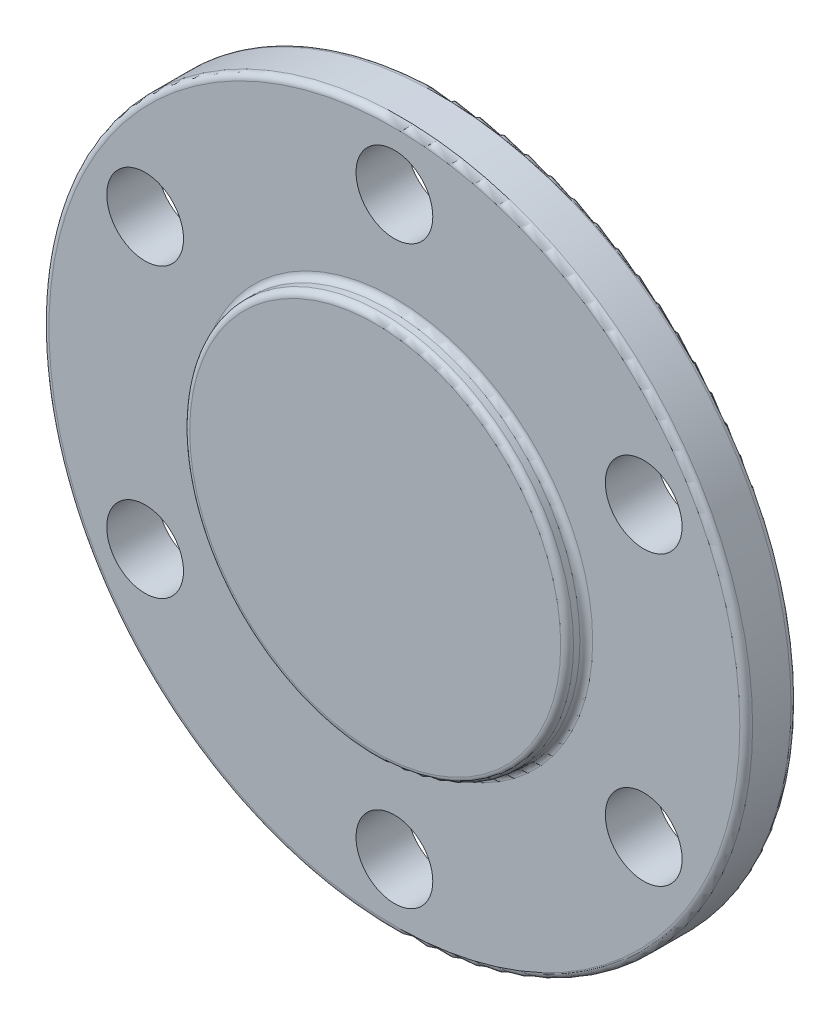
ISO-10303-21;
HEADER;
FILE_DESCRIPTION(('STEP AP214'),'2;1');
FILE_NAME('part.step','',(''),(''),'','','');
FILE_SCHEMA(('AUTOMOTIVE_DESIGN { 1 0 10303 214 1 1 1 1 }'));
ENDSEC;
DATA;
#1=APPLICATION_CONTEXT('core data for automotive mechanical design processes');
#2=APPLICATION_PROTOCOL_DEFINITION('international standard','automotive_design',2000,#1);
#3=PRODUCT_CONTEXT('',#1,'mechanical');
#4=PRODUCT('Part','Part','',(#3));
#5=PRODUCT_RELATED_PRODUCT_CATEGORY('part','',(#4));
#6=PRODUCT_DEFINITION_FORMATION('','',#4);
#7=PRODUCT_DEFINITION_CONTEXT('part definition',#1,'design');
#8=PRODUCT_DEFINITION('design','',#6,#7);
#9=PRODUCT_DEFINITION_SHAPE('','',#8);
#10=(LENGTH_UNIT() NAMED_UNIT(*) SI_UNIT(.MILLI.,.METRE.));
#11=(NAMED_UNIT(*) PLANE_ANGLE_UNIT() SI_UNIT($,.RADIAN.));
#12=(NAMED_UNIT(*) SI_UNIT($,.STERADIAN.) SOLID_ANGLE_UNIT());
#13=UNCERTAINTY_MEASURE_WITH_UNIT(LENGTH_MEASURE(1.E-05),#10,'distance_accuracy_value','');
#14=(GEOMETRIC_REPRESENTATION_CONTEXT(3) GLOBAL_UNCERTAINTY_ASSIGNED_CONTEXT((#13)) GLOBAL_UNIT_ASSIGNED_CONTEXT((#10,
#11,#12)) REPRESENTATION_CONTEXT('',''));
#15=CARTESIAN_POINT('',(0.,0.,0.));
#16=DIRECTION('',(0.,0.,1.));
#17=DIRECTION('',(1.,0.,0.));
#18=AXIS2_PLACEMENT_3D('',#15,#16,#17);
#19=CARTESIAN_POINT('',(0.,0.,2.));
#20=DIRECTION('',(0.,0.,1.));
#21=DIRECTION('',(1.,0.,0.));
#22=AXIS2_PLACEMENT_3D('',#19,#20,#21);
#23=PLANE('',#22);
#24=CARTESIAN_POINT('',(0.,0.,2.));
#25=DIRECTION('',(0.,0.,1.));
#26=DIRECTION('',(1.,0.,0.));
#27=AXIS2_PLACEMENT_3D('',#24,#25,#26);
#28=CIRCLE('',#27,27.);
#29=CARTESIAN_POINT('',(27.,0.,2.));
#30=VERTEX_POINT('',#29);
#31=EDGE_CURVE('E77',#30,#30,#28,.T.);
#32=ORIENTED_EDGE('',*,*,#31,.T.);
#33=EDGE_LOOP('',(#32));
#34=FACE_BOUND('',#33,.T.);
#35=CARTESIAN_POINT('',(0.,0.,2.));
#36=DIRECTION('',(0.,0.,1.));
#37=DIRECTION('',(1.,0.,0.));
#38=AXIS2_PLACEMENT_3D('',#35,#36,#37);
#39=CIRCLE('',#38,15.5);
#40=CARTESIAN_POINT('',(15.5,0.,2.));
#41=VERTEX_POINT('',#40);
#42=EDGE_CURVE('E81',#41,#41,#39,.F.);
#43=ORIENTED_EDGE('',*,*,#42,.T.);
#44=EDGE_LOOP('',(#43));
#45=FACE_BOUND('',#44,.T.);
#46=CARTESIAN_POINT('',(-19.4855715851489,-11.2500000000006,2.));
#47=DIRECTION('',(0.,0.,1.));
#48=DIRECTION('',(1.,0.,0.));
#49=AXIS2_PLACEMENT_3D('',#46,#47,#48);
#50=CIRCLE('',#49,3.00000000000128);
#51=CARTESIAN_POINT('',(-16.4855715851476,-11.2500000000006,2.));
#52=VERTEX_POINT('',#51);
#53=EDGE_CURVE('E126',#52,#52,#50,.T.);
#54=ORIENTED_EDGE('',*,*,#53,.F.);
#55=EDGE_LOOP('',(#54));
#56=FACE_BOUND('',#55,.T.);
#57=CARTESIAN_POINT('',(19.4855715851508,-11.2499999999994,2.));
#58=DIRECTION('',(0.,0.,1.));
#59=DIRECTION('',(1.,0.,0.));
#60=AXIS2_PLACEMENT_3D('',#57,#58,#59);
#61=CIRCLE('',#60,3.00000000000085);
#62=CARTESIAN_POINT('',(22.4855715851517,-11.2499999999994,2.));
#63=VERTEX_POINT('',#62);
#64=EDGE_CURVE('E110',#63,#63,#61,.T.);
#65=ORIENTED_EDGE('',*,*,#64,.F.);
#66=EDGE_LOOP('',(#65));
#67=FACE_BOUND('',#66,.T.);
#68=CARTESIAN_POINT('',(0.,22.5,2.));
#69=DIRECTION('',(0.,0.,1.));
#70=DIRECTION('',(1.,0.,0.));
#71=AXIS2_PLACEMENT_3D('',#68,#69,#70);
#72=CIRCLE('',#71,3.);
#73=CARTESIAN_POINT('',(3.,22.5,2.));
#74=VERTEX_POINT('',#73);
#75=EDGE_CURVE('E97',#74,#74,#72,.T.);
#76=ORIENTED_EDGE('',*,*,#75,.F.);
#77=EDGE_LOOP('',(#76));
#78=FACE_BOUND('',#77,.T.);
#79=CARTESIAN_POINT('',(19.4855715851502,11.2500000000006,2.));
#80=DIRECTION('',(0.,0.,1.));
#81=DIRECTION('',(1.,0.,0.));
#82=AXIS2_PLACEMENT_3D('',#79,#80,#81);
#83=CIRCLE('',#82,3.0000000000002);
#84=CARTESIAN_POINT('',(22.4855715851504,11.2500000000006,2.));
#85=VERTEX_POINT('',#84);
#86=EDGE_CURVE('E102',#85,#85,#83,.T.);
#87=ORIENTED_EDGE('',*,*,#86,.F.);
#88=EDGE_LOOP('',(#87));
#89=FACE_BOUND('',#88,.T.);
#90=CARTESIAN_POINT('',(1.27071055847394E-12,-22.5,2.));
#91=DIRECTION('',(0.,0.,1.));
#92=DIRECTION('',(1.,0.,0.));
#93=AXIS2_PLACEMENT_3D('',#90,#91,#92);
#94=CIRCLE('',#93,3.00000000000137);
#95=CARTESIAN_POINT('',(3.00000000000264,-22.5,2.));
#96=VERTEX_POINT('',#95);
#97=EDGE_CURVE('E118',#96,#96,#94,.T.);
#98=ORIENTED_EDGE('',*,*,#97,.F.);
#99=EDGE_LOOP('',(#98));
#100=FACE_BOUND('',#99,.T.);
#101=CARTESIAN_POINT('',(-19.4855715851496,11.2499999999994,2.));
#102=DIRECTION('',(0.,0.,1.));
#103=DIRECTION('',(1.,0.,0.));
#104=AXIS2_PLACEMENT_3D('',#101,#102,#103);
#105=CIRCLE('',#104,3.00000000000073);
#106=CARTESIAN_POINT('',(-16.4855715851488,11.2499999999994,2.));
#107=VERTEX_POINT('',#106);
#108=EDGE_CURVE('E134',#107,#107,#105,.T.);
#109=ORIENTED_EDGE('',*,*,#108,.F.);
#110=EDGE_LOOP('',(#109));
#111=FACE_BOUND('',#110,.T.);
#112=ADVANCED_FACE('F41',(#34,#45,#56,#67,#78,#89,#100,#111),#23,.T.);
#113=CARTESIAN_POINT('',(0.,0.,-2.));
#114=DIRECTION('',(0.,0.,1.));
#115=DIRECTION('',(1.,0.,0.));
#116=AXIS2_PLACEMENT_3D('',#113,#114,#115);
#117=PLANE('',#116);
#118=CARTESIAN_POINT('',(0.,0.,-2.));
#119=DIRECTION('',(0.,0.,1.));
#120=DIRECTION('',(1.,0.,0.));
#121=AXIS2_PLACEMENT_3D('',#118,#119,#120);
#122=CIRCLE('',#121,10.5);
#123=CARTESIAN_POINT('',(10.5,0.,-2.));
#124=VERTEX_POINT('',#123);
#125=EDGE_CURVE('E49',#124,#124,#122,.T.);
#126=ORIENTED_EDGE('',*,*,#125,.T.);
#127=EDGE_LOOP('',(#126));
#128=FACE_BOUND('',#127,.T.);
#129=CARTESIAN_POINT('',(0.,0.,-2.));
#130=DIRECTION('',(0.,0.,1.));
#131=DIRECTION('',(1.,0.,0.));
#132=AXIS2_PLACEMENT_3D('',#129,#130,#131);
#133=CIRCLE('',#132,27.);
#134=CARTESIAN_POINT('',(27.,0.,-2.));
#135=VERTEX_POINT('',#134);
#136=EDGE_CURVE('E54',#135,#135,#133,.F.);
#137=ORIENTED_EDGE('',*,*,#136,.T.);
#138=EDGE_LOOP('',(#137));
#139=FACE_BOUND('',#138,.T.);
#140=CARTESIAN_POINT('',(0.,22.5,-2.));
#141=DIRECTION('',(0.,0.,1.));
#142=DIRECTION('',(1.,0.,0.));
#143=AXIS2_PLACEMENT_3D('',#140,#141,#142);
#144=CIRCLE('',#143,3.);
#145=CARTESIAN_POINT('',(3.,22.5,-2.));
#146=VERTEX_POINT('',#145);
#147=EDGE_CURVE('E98',#146,#146,#144,.T.);
#148=ORIENTED_EDGE('',*,*,#147,.T.);
#149=EDGE_LOOP('',(#148));
#150=FACE_BOUND('',#149,.T.);
#151=CARTESIAN_POINT('',(19.4855715851502,11.2500000000006,-2.));
#152=DIRECTION('',(0.,0.,1.));
#153=DIRECTION('',(1.,0.,0.));
#154=AXIS2_PLACEMENT_3D('',#151,#152,#153);
#155=CIRCLE('',#154,3.0000000000002);
#156=CARTESIAN_POINT('',(22.4855715851504,11.2500000000006,-2.));
#157=VERTEX_POINT('',#156);
#158=EDGE_CURVE('E106',#157,#157,#155,.T.);
#159=ORIENTED_EDGE('',*,*,#158,.T.);
#160=EDGE_LOOP('',(#159));
#161=FACE_BOUND('',#160,.T.);
#162=CARTESIAN_POINT('',(19.4855715851508,-11.2499999999994,-2.));
#163=DIRECTION('',(0.,0.,1.));
#164=DIRECTION('',(1.,0.,0.));
#165=AXIS2_PLACEMENT_3D('',#162,#163,#164);
#166=CIRCLE('',#165,3.00000000000085);
#167=CARTESIAN_POINT('',(22.4855715851517,-11.2499999999994,-2.));
#168=VERTEX_POINT('',#167);
#169=EDGE_CURVE('E114',#168,#168,#166,.T.);
#170=ORIENTED_EDGE('',*,*,#169,.T.);
#171=EDGE_LOOP('',(#170));
#172=FACE_BOUND('',#171,.T.);
#173=CARTESIAN_POINT('',(1.27071055847394E-12,-22.5,-2.));
#174=DIRECTION('',(0.,0.,1.));
#175=DIRECTION('',(1.,0.,0.));
#176=AXIS2_PLACEMENT_3D('',#173,#174,#175);
#177=CIRCLE('',#176,3.00000000000137);
#178=CARTESIAN_POINT('',(3.00000000000264,-22.5,-2.));
#179=VERTEX_POINT('',#178);
#180=EDGE_CURVE('E122',#179,#179,#177,.T.);
#181=ORIENTED_EDGE('',*,*,#180,.T.);
#182=EDGE_LOOP('',(#181));
#183=FACE_BOUND('',#182,.T.);
#184=CARTESIAN_POINT('',(-19.4855715851489,-11.2500000000006,-2.));
#185=DIRECTION('',(0.,0.,1.));
#186=DIRECTION('',(1.,0.,0.));
#187=AXIS2_PLACEMENT_3D('',#184,#185,#186);
#188=CIRCLE('',#187,3.00000000000128);
#189=CARTESIAN_POINT('',(-16.4855715851476,-11.2500000000006,-2.));
#190=VERTEX_POINT('',#189);
#191=EDGE_CURVE('E130',#190,#190,#188,.T.);
#192=ORIENTED_EDGE('',*,*,#191,.T.);
#193=EDGE_LOOP('',(#192));
#194=FACE_BOUND('',#193,.T.);
#195=CARTESIAN_POINT('',(-19.4855715851496,11.2499999999994,-2.));
#196=DIRECTION('',(0.,0.,1.));
#197=DIRECTION('',(1.,0.,0.));
#198=AXIS2_PLACEMENT_3D('',#195,#196,#197);
#199=CIRCLE('',#198,3.00000000000073);
#200=CARTESIAN_POINT('',(-16.4855715851488,11.2499999999994,-2.));
#201=VERTEX_POINT('',#200);
#202=EDGE_CURVE('E138',#201,#201,#199,.T.);
#203=ORIENTED_EDGE('',*,*,#202,.T.);
#204=EDGE_LOOP('',(#203));
#205=FACE_BOUND('',#204,.T.);
#206=ADVANCED_FACE('F150',(#128,#139,#150,#161,#172,#183,#194,#205),#117,.F.);
#207=CARTESIAN_POINT('',(0.,0.,2.));
#208=DIRECTION('',(0.,0.,-1.));
#209=DIRECTION('',(-1.,0.,0.));
#210=AXIS2_PLACEMENT_3D('',#207,#208,#209);
#211=CYLINDRICAL_SURFACE('',#210,27.5);
#212=CARTESIAN_POINT('',(0.,0.,1.5));
#213=DIRECTION('',(0.,0.,1.));
#214=DIRECTION('',(1.,0.,0.));
#215=AXIS2_PLACEMENT_3D('',#212,#213,#214);
#216=CIRCLE('',#215,27.5);
#217=CARTESIAN_POINT('',(27.5,0.,1.5));
#218=VERTEX_POINT('',#217);
#219=EDGE_CURVE('E69',#218,#218,#216,.F.);
#220=ORIENTED_EDGE('',*,*,#219,.T.);
#221=EDGE_LOOP('',(#220));
#222=FACE_BOUND('',#221,.T.);
#223=CARTESIAN_POINT('',(0.,0.,-1.5));
#224=DIRECTION('',(0.,0.,1.));
#225=DIRECTION('',(1.,0.,0.));
#226=AXIS2_PLACEMENT_3D('',#223,#224,#225);
#227=CIRCLE('',#226,27.5);
#228=CARTESIAN_POINT('',(27.5,0.,-1.5));
#229=VERTEX_POINT('',#228);
#230=EDGE_CURVE('E73',#229,#229,#227,.T.);
#231=ORIENTED_EDGE('',*,*,#230,.T.);
#232=EDGE_LOOP('',(#231));
#233=FACE_BOUND('',#232,.T.);
#234=ADVANCED_FACE('F156',(#222,#233),#211,.T.);
#235=CARTESIAN_POINT('',(0.,22.5,2.));
#236=DIRECTION('',(0.,0.,-1.));
#237=DIRECTION('',(-1.,0.,0.));
#238=AXIS2_PLACEMENT_3D('',#235,#236,#237);
#239=CYLINDRICAL_SURFACE('',#238,3.);
#240=ORIENTED_EDGE('',*,*,#75,.T.);
#241=EDGE_LOOP('',(#240));
#242=FACE_BOUND('',#241,.T.);
#243=ORIENTED_EDGE('',*,*,#147,.F.);
#244=EDGE_LOOP('',(#243));
#245=FACE_BOUND('',#244,.T.);
#246=ADVANCED_FACE('F160',(#242,#245),#239,.F.);
#247=CARTESIAN_POINT('',(19.4855715851502,11.2500000000006,2.));
#248=DIRECTION('',(0.,0.,-1.));
#249=DIRECTION('',(-1.,0.,0.));
#250=AXIS2_PLACEMENT_3D('',#247,#248,#249);
#251=CYLINDRICAL_SURFACE('',#250,3.0000000000002);
#252=ORIENTED_EDGE('',*,*,#86,.T.);
#253=EDGE_LOOP('',(#252));
#254=FACE_BOUND('',#253,.T.);
#255=ORIENTED_EDGE('',*,*,#158,.F.);
#256=EDGE_LOOP('',(#255));
#257=FACE_BOUND('',#256,.T.);
#258=ADVANCED_FACE('F221',(#254,#257),#251,.F.);
#259=CARTESIAN_POINT('',(19.4855715851508,-11.2499999999994,2.));
#260=DIRECTION('',(0.,0.,-1.));
#261=DIRECTION('',(-1.,0.,0.));
#262=AXIS2_PLACEMENT_3D('',#259,#260,#261);
#263=CYLINDRICAL_SURFACE('',#262,3.00000000000085);
#264=ORIENTED_EDGE('',*,*,#64,.T.);
#265=EDGE_LOOP('',(#264));
#266=FACE_BOUND('',#265,.T.);
#267=ORIENTED_EDGE('',*,*,#169,.F.);
#268=EDGE_LOOP('',(#267));
#269=FACE_BOUND('',#268,.T.);
#270=ADVANCED_FACE('F218',(#266,#269),#263,.F.);
#271=CARTESIAN_POINT('',(1.27071055847394E-12,-22.5,2.));
#272=DIRECTION('',(0.,0.,-1.));
#273=DIRECTION('',(-1.,0.,0.));
#274=AXIS2_PLACEMENT_3D('',#271,#272,#273);
#275=CYLINDRICAL_SURFACE('',#274,3.00000000000137);
#276=ORIENTED_EDGE('',*,*,#97,.T.);
#277=EDGE_LOOP('',(#276));
#278=FACE_BOUND('',#277,.T.);
#279=ORIENTED_EDGE('',*,*,#180,.F.);
#280=EDGE_LOOP('',(#279));
#281=FACE_BOUND('',#280,.T.);
#282=ADVANCED_FACE('F214',(#278,#281),#275,.F.);
#283=CARTESIAN_POINT('',(-19.4855715851489,-11.2500000000006,2.));
#284=DIRECTION('',(0.,0.,-1.));
#285=DIRECTION('',(-1.,0.,0.));
#286=AXIS2_PLACEMENT_3D('',#283,#284,#285);
#287=CYLINDRICAL_SURFACE('',#286,3.00000000000128);
#288=ORIENTED_EDGE('',*,*,#53,.T.);
#289=EDGE_LOOP('',(#288));
#290=FACE_BOUND('',#289,.T.);
#291=ORIENTED_EDGE('',*,*,#191,.F.);
#292=EDGE_LOOP('',(#291));
#293=FACE_BOUND('',#292,.T.);
#294=ADVANCED_FACE('F211',(#290,#293),#287,.F.);
#295=CARTESIAN_POINT('',(-19.4855715851496,11.2499999999994,2.));
#296=DIRECTION('',(0.,0.,-1.));
#297=DIRECTION('',(-1.,0.,0.));
#298=AXIS2_PLACEMENT_3D('',#295,#296,#297);
#299=CYLINDRICAL_SURFACE('',#298,3.00000000000073);
#300=ORIENTED_EDGE('',*,*,#108,.T.);
#301=EDGE_LOOP('',(#300));
#302=FACE_BOUND('',#301,.T.);
#303=ORIENTED_EDGE('',*,*,#202,.F.);
#304=EDGE_LOOP('',(#303));
#305=FACE_BOUND('',#304,.T.);
#306=ADVANCED_FACE('F146',(#302,#305),#299,.F.);
#307=CARTESIAN_POINT('',(0.,0.,3.5));
#308=DIRECTION('',(0.,0.,-1.));
#309=DIRECTION('',(-1.,0.,0.));
#310=AXIS2_PLACEMENT_3D('',#307,#308,#309);
#311=CYLINDRICAL_SURFACE('',#310,15.);
#312=CARTESIAN_POINT('',(0.,0.,3.));
#313=DIRECTION('',(0.,0.,1.));
#314=DIRECTION('',(1.,0.,0.));
#315=AXIS2_PLACEMENT_3D('',#312,#313,#314);
#316=CIRCLE('',#315,15.);
#317=CARTESIAN_POINT('',(15.,0.,3.));
#318=VERTEX_POINT('',#317);
#319=EDGE_CURVE('E85',#318,#318,#316,.F.);
#320=ORIENTED_EDGE('',*,*,#319,.T.);
#321=EDGE_LOOP('',(#320));
#322=FACE_BOUND('',#321,.T.);
#323=CARTESIAN_POINT('',(0.,0.,2.5));
#324=DIRECTION('',(0.,0.,1.));
#325=DIRECTION('',(1.,0.,0.));
#326=AXIS2_PLACEMENT_3D('',#323,#324,#325);
#327=CIRCLE('',#326,15.);
#328=CARTESIAN_POINT('',(15.,0.,2.5));
#329=VERTEX_POINT('',#328);
#330=EDGE_CURVE('E89',#329,#329,#327,.T.);
#331=ORIENTED_EDGE('',*,*,#330,.T.);
#332=EDGE_LOOP('',(#331));
#333=FACE_BOUND('',#332,.T.);
#334=ADVANCED_FACE('F202',(#322,#333),#311,.T.);
#335=CARTESIAN_POINT('',(0.,0.,3.5));
#336=DIRECTION('',(0.,0.,1.));
#337=DIRECTION('',(1.,0.,0.));
#338=AXIS2_PLACEMENT_3D('',#335,#336,#337);
#339=PLANE('',#338);
#340=CARTESIAN_POINT('',(0.,0.,3.5));
#341=DIRECTION('',(0.,0.,1.));
#342=DIRECTION('',(1.,0.,0.));
#343=AXIS2_PLACEMENT_3D('',#340,#341,#342);
#344=CIRCLE('',#343,14.5);
#345=CARTESIAN_POINT('',(14.5,0.,3.5));
#346=VERTEX_POINT('',#345);
#347=EDGE_CURVE('E93',#346,#346,#344,.T.);
#348=ORIENTED_EDGE('',*,*,#347,.T.);
#349=EDGE_LOOP('',(#348));
#350=FACE_BOUND('',#349,.T.);
#351=ADVANCED_FACE('F194',(#350),#339,.T.);
#352=CARTESIAN_POINT('',(0.,0.,-5.));
#353=DIRECTION('',(0.,0.,1.));
#354=DIRECTION('',(1.,0.,0.));
#355=AXIS2_PLACEMENT_3D('',#352,#353,#354);
#356=CYLINDRICAL_SURFACE('',#355,10.);
#357=CARTESIAN_POINT('',(0.,0.,-2.5));
#358=DIRECTION('',(0.,0.,1.));
#359=DIRECTION('',(1.,0.,0.));
#360=AXIS2_PLACEMENT_3D('',#357,#358,#359);
#361=CIRCLE('',#360,10.);
#362=CARTESIAN_POINT('',(10.,0.,-2.5));
#363=VERTEX_POINT('',#362);
#364=EDGE_CURVE('E59',#363,#363,#361,.F.);
#365=ORIENTED_EDGE('',*,*,#364,.T.);
#366=EDGE_LOOP('',(#365));
#367=FACE_BOUND('',#366,.T.);
#368=CARTESIAN_POINT('',(0.,0.,-4.5));
#369=DIRECTION('',(0.,0.,-1.));
#370=DIRECTION('',(-1.,0.,0.));
#371=AXIS2_PLACEMENT_3D('',#368,#369,#370);
#372=CIRCLE('',#371,10.);
#373=CARTESIAN_POINT('',(-10.,0.,-4.5));
#374=VERTEX_POINT('',#373);
#375=EDGE_CURVE('E65',#374,#374,#372,.F.);
#376=ORIENTED_EDGE('',*,*,#375,.T.);
#377=EDGE_LOOP('',(#376));
#378=FACE_BOUND('',#377,.T.);
#379=ADVANCED_FACE('F192',(#367,#378),#356,.T.);
#380=CARTESIAN_POINT('',(0.,0.,-5.));
#381=DIRECTION('',(0.,0.,-1.));
#382=DIRECTION('',(-1.,0.,0.));
#383=AXIS2_PLACEMENT_3D('',#380,#381,#382);
#384=PLANE('',#383);
#385=CARTESIAN_POINT('',(0.,0.,-5.));
#386=DIRECTION('',(0.,0.,-1.));
#387=DIRECTION('',(-1.,0.,0.));
#388=AXIS2_PLACEMENT_3D('',#385,#386,#387);
#389=CIRCLE('',#388,9.5);
#390=CARTESIAN_POINT('',(-9.5,0.,-5.));
#391=VERTEX_POINT('',#390);
#392=EDGE_CURVE('E10',#391,#391,#389,.T.);
#393=ORIENTED_EDGE('',*,*,#392,.T.);
#394=EDGE_LOOP('',(#393));
#395=FACE_BOUND('',#394,.T.);
#396=ADVANCED_FACE('F170',(#395),#384,.T.);
#397=CARTESIAN_POINT('',(0.,0.,3.));
#398=DIRECTION('',(0.,0.,1.));
#399=DIRECTION('',(1.,0.,0.));
#400=AXIS2_PLACEMENT_3D('',#397,#398,#399);
#401=TOROIDAL_SURFACE('',#400,14.5,0.5);
#402=ORIENTED_EDGE('',*,*,#319,.F.);
#403=EDGE_LOOP('',(#402));
#404=FACE_BOUND('',#403,.T.);
#405=ORIENTED_EDGE('',*,*,#347,.F.);
#406=EDGE_LOOP('',(#405));
#407=FACE_BOUND('',#406,.T.);
#408=ADVANCED_FACE('F166',(#404,#407),#401,.T.);
#409=CARTESIAN_POINT('',(0.,0.,1.5));
#410=DIRECTION('',(0.,0.,1.));
#411=DIRECTION('',(1.,0.,0.));
#412=AXIS2_PLACEMENT_3D('',#409,#410,#411);
#413=TOROIDAL_SURFACE('',#412,27.,0.5);
#414=ORIENTED_EDGE('',*,*,#219,.F.);
#415=EDGE_LOOP('',(#414));
#416=FACE_BOUND('',#415,.T.);
#417=ORIENTED_EDGE('',*,*,#31,.F.);
#418=EDGE_LOOP('',(#417));
#419=FACE_BOUND('',#418,.T.);
#420=ADVANCED_FACE('F169',(#416,#419),#413,.T.);
#421=CARTESIAN_POINT('',(0.,0.,2.5));
#422=DIRECTION('',(0.,0.,1.));
#423=DIRECTION('',(1.,0.,0.));
#424=AXIS2_PLACEMENT_3D('',#421,#422,#423);
#425=TOROIDAL_SURFACE('',#424,15.5,0.5);
#426=ORIENTED_EDGE('',*,*,#42,.F.);
#427=EDGE_LOOP('',(#426));
#428=FACE_BOUND('',#427,.T.);
#429=ORIENTED_EDGE('',*,*,#330,.F.);
#430=EDGE_LOOP('',(#429));
#431=FACE_BOUND('',#430,.T.);
#432=ADVANCED_FACE('F174',(#428,#431),#425,.F.);
#433=CARTESIAN_POINT('',(0.,0.,-2.5));
#434=DIRECTION('',(0.,0.,1.));
#435=DIRECTION('',(1.,0.,0.));
#436=AXIS2_PLACEMENT_3D('',#433,#434,#435);
#437=TOROIDAL_SURFACE('',#436,10.5,0.5);
#438=ORIENTED_EDGE('',*,*,#125,.F.);
#439=EDGE_LOOP('',(#438));
#440=FACE_BOUND('',#439,.T.);
#441=ORIENTED_EDGE('',*,*,#364,.F.);
#442=EDGE_LOOP('',(#441));
#443=FACE_BOUND('',#442,.T.);
#444=ADVANCED_FACE('F178',(#440,#443),#437,.F.);
#445=CARTESIAN_POINT('',(0.,0.,-4.5));
#446=DIRECTION('',(0.,0.,-1.));
#447=DIRECTION('',(-1.,0.,0.));
#448=AXIS2_PLACEMENT_3D('',#445,#446,#447);
#449=TOROIDAL_SURFACE('',#448,9.5,0.5);
#450=ORIENTED_EDGE('',*,*,#375,.F.);
#451=EDGE_LOOP('',(#450));
#452=FACE_BOUND('',#451,.T.);
#453=ORIENTED_EDGE('',*,*,#392,.F.);
#454=EDGE_LOOP('',(#453));
#455=FACE_BOUND('',#454,.T.);
#456=ADVANCED_FACE('F181',(#452,#455),#449,.T.);
#457=CARTESIAN_POINT('',(0.,0.,-1.5));
#458=DIRECTION('',(0.,0.,1.));
#459=DIRECTION('',(1.,0.,0.));
#460=AXIS2_PLACEMENT_3D('',#457,#458,#459);
#461=TOROIDAL_SURFACE('',#460,27.,0.5);
#462=ORIENTED_EDGE('',*,*,#136,.F.);
#463=EDGE_LOOP('',(#462));
#464=FACE_BOUND('',#463,.T.);
#465=ORIENTED_EDGE('',*,*,#230,.F.);
#466=EDGE_LOOP('',(#465));
#467=FACE_BOUND('',#466,.T.);
#468=ADVANCED_FACE('F43',(#464,#467),#461,.T.);
#469=CLOSED_SHELL('',(#112,#206,#234,#246,#258,#270,#282,#294,#306,#334,#351,#379,#396,#408,
#420,#432,#444,#456,#468));
#470=MANIFOLD_SOLID_BREP('B2',#469);
#471=ADVANCED_BREP_SHAPE_REPRESENTATION('',(#18,#470),#14);
#472=SHAPE_DEFINITION_REPRESENTATION(#9,#471);
ENDSEC;
END-ISO-10303-21;
